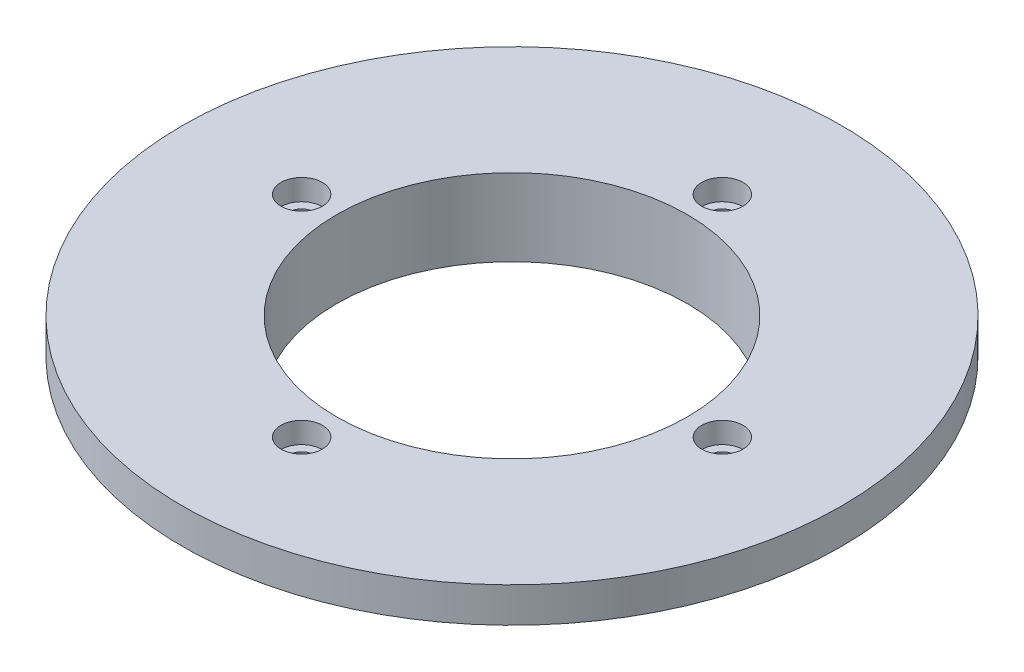
ISO-10303-21;
HEADER;
FILE_DESCRIPTION(('STEP AP214'),'2;1');
FILE_NAME('part.step','',(''),(''),'','','');
FILE_SCHEMA(('AUTOMOTIVE_DESIGN { 1 0 10303 214 1 1 1 1 }'));
ENDSEC;
DATA;
#1=APPLICATION_CONTEXT('core data for automotive mechanical design processes');
#2=APPLICATION_PROTOCOL_DEFINITION('international standard','automotive_design',2000,#1);
#3=PRODUCT_CONTEXT('',#1,'mechanical');
#4=PRODUCT('Part','Part','',(#3));
#5=PRODUCT_RELATED_PRODUCT_CATEGORY('part','',(#4));
#6=PRODUCT_DEFINITION_FORMATION('','',#4);
#7=PRODUCT_DEFINITION_CONTEXT('part definition',#1,'design');
#8=PRODUCT_DEFINITION('design','',#6,#7);
#9=PRODUCT_DEFINITION_SHAPE('','',#8);
#10=(LENGTH_UNIT() NAMED_UNIT(*) SI_UNIT(.MILLI.,.METRE.));
#11=(NAMED_UNIT(*) PLANE_ANGLE_UNIT() SI_UNIT($,.RADIAN.));
#12=(NAMED_UNIT(*) SI_UNIT($,.STERADIAN.) SOLID_ANGLE_UNIT());
#13=UNCERTAINTY_MEASURE_WITH_UNIT(LENGTH_MEASURE(1.E-05),#10,'distance_accuracy_value','');
#14=(GEOMETRIC_REPRESENTATION_CONTEXT(3) GLOBAL_UNCERTAINTY_ASSIGNED_CONTEXT((#13)) GLOBAL_UNIT_ASSIGNED_CONTEXT((#10,
#11,#12)) REPRESENTATION_CONTEXT('',''));
#15=CARTESIAN_POINT('',(0.,0.,0.));
#16=DIRECTION('',(0.,0.,1.));
#17=DIRECTION('',(1.,0.,0.));
#18=AXIS2_PLACEMENT_3D('',#15,#16,#17);
#19=CARTESIAN_POINT('',(-29.9999999999999,-11.,-5.55111512312578E-13));
#20=DIRECTION('',(0.,1.,0.));
#21=DIRECTION('',(-1.,0.,0.));
#22=AXIS2_PLACEMENT_3D('',#19,#20,#21);
#23=CYLINDRICAL_SURFACE('',#22,1.7);
#24=CARTESIAN_POINT('',(-29.9999999999999,-11.,-5.55111512312578E-13));
#25=DIRECTION('',(0.,1.,0.));
#26=DIRECTION('',(0.,0.,1.));
#27=AXIS2_PLACEMENT_3D('',#24,#25,#26);
#28=CIRCLE('',#27,1.7);
#29=CARTESIAN_POINT('',(-29.9999999999999,-11.,1.69999999999944));
#30=VERTEX_POINT('',#29);
#31=EDGE_CURVE('E66',#30,#30,#28,.T.);
#32=ORIENTED_EDGE('',*,*,#31,.F.);
#33=EDGE_LOOP('',(#32));
#34=FACE_BOUND('',#33,.T.);
#35=CARTESIAN_POINT('',(-30.,-3.00000000000001,-5.55111512312578E-13));
#36=DIRECTION('',(0.,1.,0.));
#37=DIRECTION('',(-1.,0.,0.));
#38=AXIS2_PLACEMENT_3D('',#35,#36,#37);
#39=CIRCLE('',#38,1.7);
#40=CARTESIAN_POINT('',(-31.7,-3.00000000000001,-5.55753188307418E-13));
#41=VERTEX_POINT('',#40);
#42=EDGE_CURVE('E46',#41,#41,#39,.F.);
#43=ORIENTED_EDGE('',*,*,#42,.F.);
#44=EDGE_LOOP('',(#43));
#45=FACE_BOUND('',#44,.T.);
#46=ADVANCED_FACE('F42',(#34,#45),#23,.F.);
#47=CARTESIAN_POINT('',(0.,-11.,30.));
#48=DIRECTION('',(0.,1.,0.));
#49=DIRECTION('',(-1.,0.,0.));
#50=AXIS2_PLACEMENT_3D('',#47,#48,#49);
#51=CYLINDRICAL_SURFACE('',#50,1.7);
#52=CARTESIAN_POINT('',(0.,-11.,30.));
#53=DIRECTION('',(0.,1.,0.));
#54=DIRECTION('',(1.,0.,0.));
#55=AXIS2_PLACEMENT_3D('',#52,#53,#54);
#56=CIRCLE('',#55,1.7);
#57=CARTESIAN_POINT('',(1.7,-11.,30.));
#58=VERTEX_POINT('',#57);
#59=EDGE_CURVE('E100',#58,#58,#56,.T.);
#60=ORIENTED_EDGE('',*,*,#59,.F.);
#61=EDGE_LOOP('',(#60));
#62=FACE_BOUND('',#61,.T.);
#63=CARTESIAN_POINT('',(0.,-3.00000000000003,30.));
#64=DIRECTION('',(0.,1.,0.));
#65=DIRECTION('',(-1.,0.,0.));
#66=AXIS2_PLACEMENT_3D('',#63,#64,#65);
#67=CIRCLE('',#66,1.7);
#68=CARTESIAN_POINT('',(-1.7,-3.00000000000003,30.));
#69=VERTEX_POINT('',#68);
#70=EDGE_CURVE('E71',#69,#69,#67,.F.);
#71=ORIENTED_EDGE('',*,*,#70,.F.);
#72=EDGE_LOOP('',(#71));
#73=FACE_BOUND('',#72,.T.);
#74=ADVANCED_FACE('F142',(#62,#73),#51,.F.);
#75=CARTESIAN_POINT('',(30.,-11.,1.11022302462516E-13));
#76=DIRECTION('',(0.,1.,0.));
#77=DIRECTION('',(-1.,0.,0.));
#78=AXIS2_PLACEMENT_3D('',#75,#76,#77);
#79=CYLINDRICAL_SURFACE('',#78,1.7);
#80=CARTESIAN_POINT('',(30.,-11.,1.11022302462516E-13));
#81=DIRECTION('',(0.,1.,0.));
#82=DIRECTION('',(0.,0.,-1.));
#83=AXIS2_PLACEMENT_3D('',#80,#81,#82);
#84=CIRCLE('',#83,1.7);
#85=CARTESIAN_POINT('',(30.,-11.,-1.69999999999989));
#86=VERTEX_POINT('',#85);
#87=EDGE_CURVE('E95',#86,#86,#84,.T.);
#88=ORIENTED_EDGE('',*,*,#87,.F.);
#89=EDGE_LOOP('',(#88));
#90=FACE_BOUND('',#89,.T.);
#91=CARTESIAN_POINT('',(30.,-3.,1.11022302462516E-13));
#92=DIRECTION('',(0.,1.,0.));
#93=DIRECTION('',(-1.,0.,0.));
#94=AXIS2_PLACEMENT_3D('',#91,#92,#93);
#95=CIRCLE('',#94,1.7);
#96=CARTESIAN_POINT('',(28.3,-3.,1.10380626467676E-13));
#97=VERTEX_POINT('',#96);
#98=EDGE_CURVE('E68',#97,#97,#95,.F.);
#99=ORIENTED_EDGE('',*,*,#98,.F.);
#100=EDGE_LOOP('',(#99));
#101=FACE_BOUND('',#100,.T.);
#102=ADVANCED_FACE('F148',(#90,#101),#79,.F.);
#103=CARTESIAN_POINT('',(1.38777878078145E-13,-11.,-30.));
#104=DIRECTION('',(0.,1.,0.));
#105=DIRECTION('',(-1.,0.,0.));
#106=AXIS2_PLACEMENT_3D('',#103,#104,#105);
#107=CYLINDRICAL_SURFACE('',#106,1.7);
#108=CARTESIAN_POINT('',(1.38777878078145E-13,-11.,-30.));
#109=DIRECTION('',(0.,1.,0.));
#110=DIRECTION('',(-1.,0.,0.));
#111=AXIS2_PLACEMENT_3D('',#108,#109,#110);
#112=CIRCLE('',#111,1.7);
#113=CARTESIAN_POINT('',(-1.69999999999986,-11.,-30.));
#114=VERTEX_POINT('',#113);
#115=EDGE_CURVE('E99',#114,#114,#112,.T.);
#116=ORIENTED_EDGE('',*,*,#115,.F.);
#117=EDGE_LOOP('',(#116));
#118=FACE_BOUND('',#117,.T.);
#119=CARTESIAN_POINT('',(0.,-3.,-30.));
#120=DIRECTION('',(0.,1.,0.));
#121=DIRECTION('',(-1.,0.,0.));
#122=AXIS2_PLACEMENT_3D('',#119,#120,#121);
#123=CIRCLE('',#122,1.7);
#124=CARTESIAN_POINT('',(-1.7,-3.,-30.));
#125=VERTEX_POINT('',#124);
#126=EDGE_CURVE('E62',#125,#125,#123,.F.);
#127=ORIENTED_EDGE('',*,*,#126,.F.);
#128=EDGE_LOOP('',(#127));
#129=FACE_BOUND('',#128,.T.);
#130=ADVANCED_FACE('F155',(#118,#129),#107,.F.);
#131=CARTESIAN_POINT('',(1.38777878078145E-13,-62.2558424789887,-2.77555756156289E-13));
#132=DIRECTION('',(0.,-1.,0.));
#133=DIRECTION('',(1.,0.,0.));
#134=AXIS2_PLACEMENT_3D('',#131,#132,#133);
#135=CYLINDRICAL_SURFACE('',#134,25.);
#136=CARTESIAN_POINT('',(0.,-11.,0.));
#137=DIRECTION('',(0.,-1.,0.));
#138=DIRECTION('',(1.,0.,0.));
#139=AXIS2_PLACEMENT_3D('',#136,#137,#138);
#140=CIRCLE('',#139,25.);
#141=CARTESIAN_POINT('',(25.,-11.,0.));
#142=VERTEX_POINT('',#141);
#143=EDGE_CURVE('E110',#142,#142,#140,.T.);
#144=ORIENTED_EDGE('',*,*,#143,.T.);
#145=EDGE_LOOP('',(#144));
#146=FACE_BOUND('',#145,.T.);
#147=CARTESIAN_POINT('',(0.,0.,0.));
#148=DIRECTION('',(0.,-1.,0.));
#149=DIRECTION('',(1.,0.,0.));
#150=AXIS2_PLACEMENT_3D('',#147,#148,#149);
#151=CIRCLE('',#150,25.);
#152=CARTESIAN_POINT('',(25.,0.,0.));
#153=VERTEX_POINT('',#152);
#154=EDGE_CURVE('E10',#153,#153,#151,.T.);
#155=ORIENTED_EDGE('',*,*,#154,.F.);
#156=EDGE_LOOP('',(#155));
#157=FACE_BOUND('',#156,.T.);
#158=ADVANCED_FACE('F44',(#146,#157),#135,.F.);
#159=CARTESIAN_POINT('',(24.9999999999997,0.,0.));
#160=DIRECTION('',(0.,1.,0.));
#161=DIRECTION('',(-1.,0.,0.));
#162=AXIS2_PLACEMENT_3D('',#159,#160,#161);
#163=PLANE('',#162);
#164=CARTESIAN_POINT('',(30.,0.,1.11022302462516E-13));
#165=DIRECTION('',(0.,1.,0.));
#166=DIRECTION('',(0.,0.,-1.));
#167=AXIS2_PLACEMENT_3D('',#164,#165,#166);
#168=CIRCLE('',#167,2.95);
#169=CARTESIAN_POINT('',(30.,0.,-2.94999999999989));
#170=VERTEX_POINT('',#169);
#171=EDGE_CURVE('E344',#170,#170,#168,.T.);
#172=ORIENTED_EDGE('',*,*,#171,.F.);
#173=EDGE_LOOP('',(#172));
#174=FACE_BOUND('',#173,.T.);
#175=CARTESIAN_POINT('',(1.38777878078145E-13,0.,30.));
#176=DIRECTION('',(0.,1.,0.));
#177=DIRECTION('',(1.,0.,0.));
#178=AXIS2_PLACEMENT_3D('',#175,#176,#177);
#179=CIRCLE('',#178,2.95);
#180=CARTESIAN_POINT('',(2.95000000000014,0.,30.));
#181=VERTEX_POINT('',#180);
#182=EDGE_CURVE('E334',#181,#181,#179,.T.);
#183=ORIENTED_EDGE('',*,*,#182,.F.);
#184=EDGE_LOOP('',(#183));
#185=FACE_BOUND('',#184,.T.);
#186=CARTESIAN_POINT('',(-30.,0.,-5.55111512312578E-13));
#187=DIRECTION('',(0.,1.,0.));
#188=DIRECTION('',(0.,0.,1.));
#189=AXIS2_PLACEMENT_3D('',#186,#187,#188);
#190=CIRCLE('',#189,2.95);
#191=CARTESIAN_POINT('',(-30.,0.,2.94999999999945));
#192=VERTEX_POINT('',#191);
#193=EDGE_CURVE('E329',#192,#192,#190,.T.);
#194=ORIENTED_EDGE('',*,*,#193,.F.);
#195=EDGE_LOOP('',(#194));
#196=FACE_BOUND('',#195,.T.);
#197=CARTESIAN_POINT('',(0.,0.,-30.));
#198=DIRECTION('',(0.,1.,0.));
#199=DIRECTION('',(-1.,0.,0.));
#200=AXIS2_PLACEMENT_3D('',#197,#198,#199);
#201=CIRCLE('',#200,2.95);
#202=CARTESIAN_POINT('',(-2.95,0.,-30.));
#203=VERTEX_POINT('',#202);
#204=EDGE_CURVE('E80',#203,#203,#201,.T.);
#205=ORIENTED_EDGE('',*,*,#204,.F.);
#206=EDGE_LOOP('',(#205));
#207=FACE_BOUND('',#206,.T.);
#208=ORIENTED_EDGE('',*,*,#154,.T.);
#209=EDGE_LOOP('',(#208));
#210=FACE_BOUND('',#209,.T.);
#211=CARTESIAN_POINT('',(0.,0.,0.));
#212=DIRECTION('',(0.,-1.,0.));
#213=DIRECTION('',(1.,0.,0.));
#214=AXIS2_PLACEMENT_3D('',#211,#212,#213);
#215=CIRCLE('',#214,47.);
#216=CARTESIAN_POINT('',(47.0000000000001,0.,0.));
#217=VERTEX_POINT('',#216);
#218=EDGE_CURVE('E51',#217,#217,#215,.T.);
#219=ORIENTED_EDGE('',*,*,#218,.F.);
#220=EDGE_LOOP('',(#219));
#221=FACE_BOUND('',#220,.T.);
#222=ADVANCED_FACE('F131',(#174,#185,#196,#207,#210,#221),#163,.T.);
#223=CARTESIAN_POINT('',(1.38777878078145E-13,-62.2558424789887,-2.77555756156289E-13));
#224=DIRECTION('',(0.,-1.,0.));
#225=DIRECTION('',(1.,0.,0.));
#226=AXIS2_PLACEMENT_3D('',#223,#224,#225);
#227=CYLINDRICAL_SURFACE('',#226,47.);
#228=ORIENTED_EDGE('',*,*,#218,.T.);
#229=EDGE_LOOP('',(#228));
#230=FACE_BOUND('',#229,.T.);
#231=CARTESIAN_POINT('',(1.38777878078145E-13,-5.00000000000002,0.));
#232=DIRECTION('',(0.,-1.,0.));
#233=DIRECTION('',(1.,0.,0.));
#234=AXIS2_PLACEMENT_3D('',#231,#232,#233);
#235=CIRCLE('',#234,47.);
#236=CARTESIAN_POINT('',(47.0000000000002,-5.00000000000001,0.));
#237=VERTEX_POINT('',#236);
#238=EDGE_CURVE('E58',#237,#237,#235,.T.);
#239=ORIENTED_EDGE('',*,*,#238,.F.);
#240=EDGE_LOOP('',(#239));
#241=FACE_BOUND('',#240,.T.);
#242=ADVANCED_FACE('F129',(#230,#241),#227,.T.);
#243=CARTESIAN_POINT('',(46.9999999999999,-5.,-2.77555756156289E-13));
#244=DIRECTION('',(0.,-1.,0.));
#245=DIRECTION('',(1.,0.,0.));
#246=AXIS2_PLACEMENT_3D('',#243,#244,#245);
#247=PLANE('',#246);
#248=ORIENTED_EDGE('',*,*,#238,.T.);
#249=EDGE_LOOP('',(#248));
#250=FACE_BOUND('',#249,.T.);
#251=CARTESIAN_POINT('',(1.38777878078145E-13,-5.00000000000002,0.));
#252=DIRECTION('',(0.,-1.,0.));
#253=DIRECTION('',(1.,0.,0.));
#254=AXIS2_PLACEMENT_3D('',#251,#252,#253);
#255=CIRCLE('',#254,35.);
#256=CARTESIAN_POINT('',(35.0000000000002,-5.00000000000001,0.));
#257=VERTEX_POINT('',#256);
#258=EDGE_CURVE('E118',#257,#257,#255,.T.);
#259=ORIENTED_EDGE('',*,*,#258,.F.);
#260=EDGE_LOOP('',(#259));
#261=FACE_BOUND('',#260,.T.);
#262=ADVANCED_FACE('F126',(#250,#261),#247,.T.);
#263=CARTESIAN_POINT('',(1.38777878078145E-13,-62.2558424789887,-2.77555756156289E-13));
#264=DIRECTION('',(0.,-1.,0.));
#265=DIRECTION('',(1.,0.,0.));
#266=AXIS2_PLACEMENT_3D('',#263,#264,#265);
#267=CYLINDRICAL_SURFACE('',#266,35.);
#268=ORIENTED_EDGE('',*,*,#258,.T.);
#269=EDGE_LOOP('',(#268));
#270=FACE_BOUND('',#269,.T.);
#271=CARTESIAN_POINT('',(0.,-11.,0.));
#272=DIRECTION('',(0.,-1.,0.));
#273=DIRECTION('',(1.,0.,0.));
#274=AXIS2_PLACEMENT_3D('',#271,#272,#273);
#275=CIRCLE('',#274,35.);
#276=CARTESIAN_POINT('',(35.0000000000001,-11.,0.));
#277=VERTEX_POINT('',#276);
#278=EDGE_CURVE('E114',#277,#277,#275,.T.);
#279=ORIENTED_EDGE('',*,*,#278,.F.);
#280=EDGE_LOOP('',(#279));
#281=FACE_BOUND('',#280,.T.);
#282=ADVANCED_FACE('F138',(#270,#281),#267,.T.);
#283=CARTESIAN_POINT('',(35.0000000000001,-11.,0.));
#284=DIRECTION('',(0.,-1.,0.));
#285=DIRECTION('',(1.,0.,0.));
#286=AXIS2_PLACEMENT_3D('',#283,#284,#285);
#287=PLANE('',#286);
#288=ORIENTED_EDGE('',*,*,#87,.T.);
#289=EDGE_LOOP('',(#288));
#290=FACE_BOUND('',#289,.T.);
#291=ORIENTED_EDGE('',*,*,#59,.T.);
#292=EDGE_LOOP('',(#291));
#293=FACE_BOUND('',#292,.T.);
#294=ORIENTED_EDGE('',*,*,#31,.T.);
#295=EDGE_LOOP('',(#294));
#296=FACE_BOUND('',#295,.T.);
#297=ORIENTED_EDGE('',*,*,#115,.T.);
#298=EDGE_LOOP('',(#297));
#299=FACE_BOUND('',#298,.T.);
#300=ORIENTED_EDGE('',*,*,#278,.T.);
#301=EDGE_LOOP('',(#300));
#302=FACE_BOUND('',#301,.T.);
#303=ORIENTED_EDGE('',*,*,#143,.F.);
#304=EDGE_LOOP('',(#303));
#305=FACE_BOUND('',#304,.T.);
#306=ADVANCED_FACE('F159',(#290,#293,#296,#299,#302,#305),#287,.T.);
#307=CARTESIAN_POINT('',(0.,-3.,-30.));
#308=DIRECTION('',(0.,1.,0.));
#309=DIRECTION('',(-1.,0.,0.));
#310=AXIS2_PLACEMENT_3D('',#307,#308,#309);
#311=PLANE('',#310);
#312=CARTESIAN_POINT('',(0.,-3.,-30.));
#313=DIRECTION('',(0.,1.,0.));
#314=DIRECTION('',(-1.,0.,0.));
#315=AXIS2_PLACEMENT_3D('',#312,#313,#314);
#316=CIRCLE('',#315,2.95);
#317=CARTESIAN_POINT('',(-2.95,-3.,-30.));
#318=VERTEX_POINT('',#317);
#319=EDGE_CURVE('E67',#318,#318,#316,.T.);
#320=ORIENTED_EDGE('',*,*,#319,.T.);
#321=EDGE_LOOP('',(#320));
#322=FACE_BOUND('',#321,.T.);
#323=ORIENTED_EDGE('',*,*,#126,.T.);
#324=EDGE_LOOP('',(#323));
#325=FACE_BOUND('',#324,.T.);
#326=ADVANCED_FACE('F162',(#322,#325),#311,.T.);
#327=CARTESIAN_POINT('',(0.,-3.,-30.));
#328=DIRECTION('',(0.,1.,0.));
#329=DIRECTION('',(-1.,0.,0.));
#330=AXIS2_PLACEMENT_3D('',#327,#328,#329);
#331=CYLINDRICAL_SURFACE('',#330,2.95);
#332=ORIENTED_EDGE('',*,*,#319,.F.);
#333=EDGE_LOOP('',(#332));
#334=FACE_BOUND('',#333,.T.);
#335=ORIENTED_EDGE('',*,*,#204,.T.);
#336=EDGE_LOOP('',(#335));
#337=FACE_BOUND('',#336,.T.);
#338=ADVANCED_FACE('F216',(#334,#337),#331,.F.);
#339=CARTESIAN_POINT('',(30.,-3.,1.11022302462516E-13));
#340=DIRECTION('',(0.,1.,0.));
#341=DIRECTION('',(0.,0.,-1.));
#342=AXIS2_PLACEMENT_3D('',#339,#340,#341);
#343=PLANE('',#342);
#344=CARTESIAN_POINT('',(30.,-3.,1.11022302462516E-13));
#345=DIRECTION('',(0.,1.,0.));
#346=DIRECTION('',(0.,0.,-1.));
#347=AXIS2_PLACEMENT_3D('',#344,#345,#346);
#348=CIRCLE('',#347,2.95);
#349=CARTESIAN_POINT('',(30.,-3.,-2.94999999999989));
#350=VERTEX_POINT('',#349);
#351=EDGE_CURVE('E72',#350,#350,#348,.T.);
#352=ORIENTED_EDGE('',*,*,#351,.T.);
#353=EDGE_LOOP('',(#352));
#354=FACE_BOUND('',#353,.T.);
#355=ORIENTED_EDGE('',*,*,#98,.T.);
#356=EDGE_LOOP('',(#355));
#357=FACE_BOUND('',#356,.T.);
#358=ADVANCED_FACE('F226',(#354,#357),#343,.T.);
#359=CARTESIAN_POINT('',(30.,-3.,1.11022302462516E-13));
#360=DIRECTION('',(0.,1.,0.));
#361=DIRECTION('',(-1.,0.,0.));
#362=AXIS2_PLACEMENT_3D('',#359,#360,#361);
#363=CYLINDRICAL_SURFACE('',#362,2.95);
#364=ORIENTED_EDGE('',*,*,#351,.F.);
#365=EDGE_LOOP('',(#364));
#366=FACE_BOUND('',#365,.T.);
#367=ORIENTED_EDGE('',*,*,#171,.T.);
#368=EDGE_LOOP('',(#367));
#369=FACE_BOUND('',#368,.T.);
#370=ADVANCED_FACE('F237',(#366,#369),#363,.F.);
#371=CARTESIAN_POINT('',(0.,-3.00000000000003,30.));
#372=DIRECTION('',(0.,1.,0.));
#373=DIRECTION('',(1.,0.,0.));
#374=AXIS2_PLACEMENT_3D('',#371,#372,#373);
#375=PLANE('',#374);
#376=CARTESIAN_POINT('',(0.,-3.00000000000003,30.));
#377=DIRECTION('',(0.,1.,0.));
#378=DIRECTION('',(1.,0.,0.));
#379=AXIS2_PLACEMENT_3D('',#376,#377,#378);
#380=CIRCLE('',#379,2.95);
#381=CARTESIAN_POINT('',(2.95,-3.00000000000003,30.));
#382=VERTEX_POINT('',#381);
#383=EDGE_CURVE('E340',#382,#382,#380,.T.);
#384=ORIENTED_EDGE('',*,*,#383,.T.);
#385=EDGE_LOOP('',(#384));
#386=FACE_BOUND('',#385,.T.);
#387=ORIENTED_EDGE('',*,*,#70,.T.);
#388=EDGE_LOOP('',(#387));
#389=FACE_BOUND('',#388,.T.);
#390=ADVANCED_FACE('F248',(#386,#389),#375,.T.);
#391=CARTESIAN_POINT('',(0.,-3.00000000000003,30.));
#392=DIRECTION('',(0.,1.,0.));
#393=DIRECTION('',(-1.,0.,0.));
#394=AXIS2_PLACEMENT_3D('',#391,#392,#393);
#395=CYLINDRICAL_SURFACE('',#394,2.95);
#396=ORIENTED_EDGE('',*,*,#383,.F.);
#397=EDGE_LOOP('',(#396));
#398=FACE_BOUND('',#397,.T.);
#399=ORIENTED_EDGE('',*,*,#182,.T.);
#400=EDGE_LOOP('',(#399));
#401=FACE_BOUND('',#400,.T.);
#402=ADVANCED_FACE('F258',(#398,#401),#395,.F.);
#403=CARTESIAN_POINT('',(-30.,-3.00000000000001,-5.55111512312578E-13));
#404=DIRECTION('',(0.,1.,0.));
#405=DIRECTION('',(0.,0.,1.));
#406=AXIS2_PLACEMENT_3D('',#403,#404,#405);
#407=PLANE('',#406);
#408=CARTESIAN_POINT('',(-30.,-3.00000000000001,-5.55111512312578E-13));
#409=DIRECTION('',(0.,1.,0.));
#410=DIRECTION('',(0.,0.,1.));
#411=AXIS2_PLACEMENT_3D('',#408,#409,#410);
#412=CIRCLE('',#411,2.95);
#413=CARTESIAN_POINT('',(-30.,-3.00000000000001,2.94999999999945));
#414=VERTEX_POINT('',#413);
#415=EDGE_CURVE('E326',#414,#414,#412,.T.);
#416=ORIENTED_EDGE('',*,*,#415,.T.);
#417=EDGE_LOOP('',(#416));
#418=FACE_BOUND('',#417,.T.);
#419=ORIENTED_EDGE('',*,*,#42,.T.);
#420=EDGE_LOOP('',(#419));
#421=FACE_BOUND('',#420,.T.);
#422=ADVANCED_FACE('F268',(#418,#421),#407,.T.);
#423=CARTESIAN_POINT('',(-30.,-3.00000000000001,-5.55111512312578E-13));
#424=DIRECTION('',(0.,1.,0.));
#425=DIRECTION('',(-1.,0.,0.));
#426=AXIS2_PLACEMENT_3D('',#423,#424,#425);
#427=CYLINDRICAL_SURFACE('',#426,2.95);
#428=ORIENTED_EDGE('',*,*,#415,.F.);
#429=EDGE_LOOP('',(#428));
#430=FACE_BOUND('',#429,.T.);
#431=ORIENTED_EDGE('',*,*,#193,.T.);
#432=EDGE_LOOP('',(#431));
#433=FACE_BOUND('',#432,.T.);
#434=ADVANCED_FACE('F278',(#430,#433),#427,.F.);
#435=CLOSED_SHELL('',(#46,#74,#102,#130,#158,#222,#242,#262,#282,#306,#326,#338,#358,#370,#390,
#402,#422,#434));
#436=MANIFOLD_SOLID_BREP('B2',#435);
#437=ADVANCED_BREP_SHAPE_REPRESENTATION('',(#18,#436),#14);
#438=SHAPE_DEFINITION_REPRESENTATION(#9,#437);
ENDSEC;
END-ISO-10303-21;
